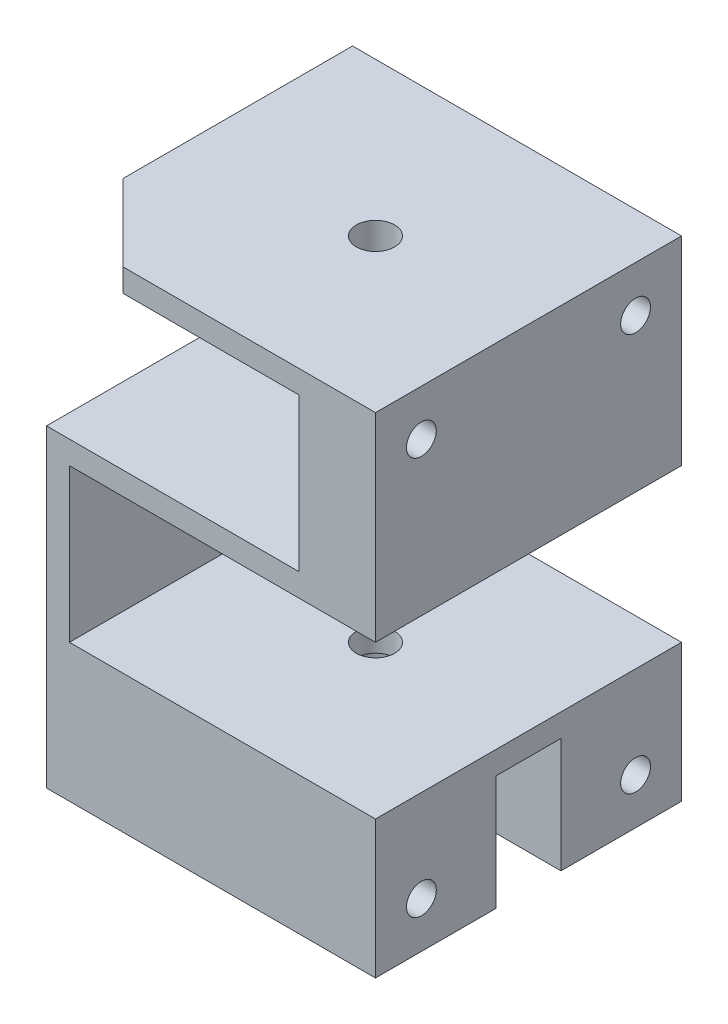
ISO-10303-21;
HEADER;
FILE_DESCRIPTION(('STEP AP214'),'2;1');
FILE_NAME('part.step','',(''),(''),'','','');
FILE_SCHEMA(('AUTOMOTIVE_DESIGN { 1 0 10303 214 1 1 1 1 }'));
ENDSEC;
DATA;
#1=APPLICATION_CONTEXT('core data for automotive mechanical design processes');
#2=APPLICATION_PROTOCOL_DEFINITION('international standard','automotive_design',2000,#1);
#3=PRODUCT_CONTEXT('',#1,'mechanical');
#4=PRODUCT('Part','Part','',(#3));
#5=PRODUCT_RELATED_PRODUCT_CATEGORY('part','',(#4));
#6=PRODUCT_DEFINITION_FORMATION('','',#4);
#7=PRODUCT_DEFINITION_CONTEXT('part definition',#1,'design');
#8=PRODUCT_DEFINITION('design','',#6,#7);
#9=PRODUCT_DEFINITION_SHAPE('','',#8);
#10=(LENGTH_UNIT() NAMED_UNIT(*) SI_UNIT(.MILLI.,.METRE.));
#11=(NAMED_UNIT(*) PLANE_ANGLE_UNIT() SI_UNIT($,.RADIAN.));
#12=(NAMED_UNIT(*) SI_UNIT($,.STERADIAN.) SOLID_ANGLE_UNIT());
#13=UNCERTAINTY_MEASURE_WITH_UNIT(LENGTH_MEASURE(1.E-05),#10,'distance_accuracy_value','');
#14=(GEOMETRIC_REPRESENTATION_CONTEXT(3) GLOBAL_UNCERTAINTY_ASSIGNED_CONTEXT((#13)) GLOBAL_UNIT_ASSIGNED_CONTEXT((#10,
#11,#12)) REPRESENTATION_CONTEXT('',''));
#15=CARTESIAN_POINT('',(0.,0.,0.));
#16=DIRECTION('',(0.,0.,1.));
#17=DIRECTION('',(1.,0.,0.));
#18=AXIS2_PLACEMENT_3D('',#15,#16,#17);
#19=CARTESIAN_POINT('',(-10.,43.,40.));
#20=DIRECTION('',(0.,1.,0.));
#21=DIRECTION('',(0.,0.,1.));
#22=AXIS2_PLACEMENT_3D('',#19,#20,#21);
#23=PLANE('',#22);
#24=CARTESIAN_POINT('',(-20.,43.,20.));
#25=DIRECTION('',(0.,1.,0.));
#26=DIRECTION('',(0.,0.,1.));
#27=AXIS2_PLACEMENT_3D('',#24,#25,#26);
#28=CIRCLE('',#27,3.99999999999999);
#29=CARTESIAN_POINT('',(-20.,43.,24.));
#30=VERTEX_POINT('',#29);
#31=EDGE_CURVE('E348',#30,#30,#28,.T.);
#32=ORIENTED_EDGE('',*,*,#31,.T.);
#33=EDGE_LOOP('',(#32));
#34=FACE_BOUND('',#33,.T.);
#35=DIRECTION('',(1.,0.,0.));
#36=VECTOR('',#35,1.);
#37=CARTESIAN_POINT('',(-10.,43.,40.));
#38=LINE('',#37,#36);
#39=CARTESIAN_POINT('',(-33.,43.,40.));
#40=VERTEX_POINT('',#39);
#41=CARTESIAN_POINT('',(-10.,43.,40.));
#42=VERTEX_POINT('',#41);
#43=EDGE_CURVE('E281',#40,#42,#38,.T.);
#44=ORIENTED_EDGE('',*,*,#43,.F.);
#45=DIRECTION('',(0.707106781186546,0.,0.707106781186549));
#46=VECTOR('',#45,1.);
#47=CARTESIAN_POINT('',(-33.,43.,40.));
#48=LINE('',#47,#46);
#49=CARTESIAN_POINT('',(-43.,43.,30.));
#50=VERTEX_POINT('',#49);
#51=EDGE_CURVE('E55',#40,#50,#48,.F.);
#52=ORIENTED_EDGE('',*,*,#51,.T.);
#53=DIRECTION('',(0.,0.,-1.));
#54=VECTOR('',#53,1.);
#55=CARTESIAN_POINT('',(-43.,43.,40.));
#56=LINE('',#55,#54);
#57=CARTESIAN_POINT('',(-43.,43.,9.));
#58=VERTEX_POINT('',#57);
#59=EDGE_CURVE('E325',#50,#58,#56,.T.);
#60=ORIENTED_EDGE('',*,*,#59,.T.);
#61=DIRECTION('',(-1.,0.,0.));
#62=VECTOR('',#61,1.);
#63=CARTESIAN_POINT('',(-10.,43.,9.));
#64=LINE('',#63,#62);
#65=CARTESIAN_POINT('',(-13.,43.,9.));
#66=VERTEX_POINT('',#65);
#67=EDGE_CURVE('E493',#66,#58,#64,.T.);
#68=ORIENTED_EDGE('',*,*,#67,.F.);
#69=DIRECTION('',(-0.707106781186551,0.,-0.707106781186544));
#70=VECTOR('',#69,1.);
#71=CARTESIAN_POINT('',(-13.,43.,9.));
#72=LINE('',#71,#70);
#73=CARTESIAN_POINT('',(-10.,43.,12.));
#74=VERTEX_POINT('',#73);
#75=EDGE_CURVE('E363',#66,#74,#72,.F.);
#76=ORIENTED_EDGE('',*,*,#75,.T.);
#77=DIRECTION('',(0.,0.,-1.));
#78=VECTOR('',#77,1.);
#79=CARTESIAN_POINT('',(-10.,43.,40.));
#80=LINE('',#79,#78);
#81=EDGE_CURVE('E322',#42,#74,#80,.T.);
#82=ORIENTED_EDGE('',*,*,#81,.F.);
#83=EDGE_LOOP('',(#44,#52,#60,#68,#76,#82));
#84=FACE_BOUND('',#83,.T.);
#85=ADVANCED_FACE('F33',(#34,#84),#23,.F.);
#86=CARTESIAN_POINT('',(-43.,23.,40.));
#87=DIRECTION('',(0.,-1.,0.));
#88=DIRECTION('',(0.,0.,-1.));
#89=AXIS2_PLACEMENT_3D('',#86,#87,#88);
#90=PLANE('',#89);
#91=CARTESIAN_POINT('',(-20.,23.,20.));
#92=DIRECTION('',(0.,-1.,0.));
#93=DIRECTION('',(0.,0.,-1.));
#94=AXIS2_PLACEMENT_3D('',#91,#92,#93);
#95=CIRCLE('',#94,3.99999999999998);
#96=CARTESIAN_POINT('',(-20.,23.,16.));
#97=VERTEX_POINT('',#96);
#98=EDGE_CURVE('E343',#97,#97,#95,.T.);
#99=ORIENTED_EDGE('',*,*,#98,.T.);
#100=EDGE_LOOP('',(#99));
#101=FACE_BOUND('',#100,.T.);
#102=DIRECTION('',(0.,0.,-1.));
#103=VECTOR('',#102,1.);
#104=CARTESIAN_POINT('',(-10.,23.,40.));
#105=LINE('',#104,#103);
#106=CARTESIAN_POINT('',(-10.,23.,40.));
#107=VERTEX_POINT('',#106);
#108=CARTESIAN_POINT('',(-10.,23.,12.));
#109=VERTEX_POINT('',#108);
#110=EDGE_CURVE('E319',#107,#109,#105,.T.);
#111=ORIENTED_EDGE('',*,*,#110,.T.);
#112=DIRECTION('',(0.707106781186551,0.,0.707106781186544));
#113=VECTOR('',#112,1.);
#114=CARTESIAN_POINT('',(-13.,23.,9.));
#115=LINE('',#114,#113);
#116=CARTESIAN_POINT('',(-13.,23.,9.));
#117=VERTEX_POINT('',#116);
#118=EDGE_CURVE('E367',#109,#117,#115,.F.);
#119=ORIENTED_EDGE('',*,*,#118,.T.);
#120=DIRECTION('',(-1.,0.,0.));
#121=VECTOR('',#120,1.);
#122=CARTESIAN_POINT('',(0.,23.,9.));
#123=LINE('',#122,#121);
#124=CARTESIAN_POINT('',(-43.,23.,9.));
#125=VERTEX_POINT('',#124);
#126=EDGE_CURVE('E392',#117,#125,#123,.T.);
#127=ORIENTED_EDGE('',*,*,#126,.T.);
#128=DIRECTION('',(0.,0.,-1.));
#129=VECTOR('',#128,1.);
#130=CARTESIAN_POINT('',(-43.,23.,40.));
#131=LINE('',#130,#129);
#132=CARTESIAN_POINT('',(-43.,23.,40.));
#133=VERTEX_POINT('',#132);
#134=EDGE_CURVE('E316',#133,#125,#131,.T.);
#135=ORIENTED_EDGE('',*,*,#134,.F.);
#136=DIRECTION('',(-1.,0.,0.));
#137=VECTOR('',#136,1.);
#138=CARTESIAN_POINT('',(-43.,23.,40.));
#139=LINE('',#138,#137);
#140=EDGE_CURVE('E285',#107,#133,#139,.T.);
#141=ORIENTED_EDGE('',*,*,#140,.F.);
#142=EDGE_LOOP('',(#111,#119,#127,#135,#141));
#143=FACE_BOUND('',#142,.T.);
#144=ADVANCED_FACE('F390',(#101,#143),#90,.F.);
#145=CARTESIAN_POINT('',(-10.,23.,40.));
#146=DIRECTION('',(1.,0.,0.));
#147=DIRECTION('',(0.,0.,-1.));
#148=AXIS2_PLACEMENT_3D('',#145,#146,#147);
#149=PLANE('',#148);
#150=ORIENTED_EDGE('',*,*,#81,.T.);
#151=DIRECTION('',(0.,-1.,0.));
#152=VECTOR('',#151,1.);
#153=CARTESIAN_POINT('',(-10.,23.,12.));
#154=LINE('',#153,#152);
#155=EDGE_CURVE('E365',#74,#109,#154,.T.);
#156=ORIENTED_EDGE('',*,*,#155,.T.);
#157=ORIENTED_EDGE('',*,*,#110,.F.);
#158=DIRECTION('',(0.,-1.,0.));
#159=VECTOR('',#158,1.);
#160=CARTESIAN_POINT('',(-10.,23.,40.));
#161=LINE('',#160,#159);
#162=EDGE_CURVE('E283',#42,#107,#161,.T.);
#163=ORIENTED_EDGE('',*,*,#162,.F.);
#164=EDGE_LOOP('',(#150,#156,#157,#163));
#165=FACE_BOUND('',#164,.T.);
#166=ADVANCED_FACE('F384',(#165),#149,.F.);
#167=CARTESIAN_POINT('',(-20.,46.,20.));
#168=DIRECTION('',(0.,-1.,0.));
#169=DIRECTION('',(1.,0.,0.));
#170=AXIS2_PLACEMENT_3D('',#167,#168,#169);
#171=CYLINDRICAL_SURFACE('',#170,2.5);
#172=CARTESIAN_POINT('',(-20.,0.,20.));
#173=DIRECTION('',(0.,-1.,0.));
#174=DIRECTION('',(1.,0.,0.));
#175=AXIS2_PLACEMENT_3D('',#172,#173,#174);
#176=CIRCLE('',#175,2.5);
#177=CARTESIAN_POINT('',(-17.5,0.,20.));
#178=VERTEX_POINT('',#177);
#179=EDGE_CURVE('E262',#178,#178,#176,.T.);
#180=ORIENTED_EDGE('',*,*,#179,.F.);
#181=EDGE_LOOP('',(#180));
#182=FACE_BOUND('',#181,.T.);
#183=CARTESIAN_POINT('',(-20.,-3.,20.));
#184=DIRECTION('',(0.,-1.,0.));
#185=DIRECTION('',(1.,0.,0.));
#186=AXIS2_PLACEMENT_3D('',#183,#184,#185);
#187=CIRCLE('',#186,2.5);
#188=CARTESIAN_POINT('',(-17.5,-3.,20.));
#189=VERTEX_POINT('',#188);
#190=EDGE_CURVE('E248',#189,#189,#187,.F.);
#191=ORIENTED_EDGE('',*,*,#190,.F.);
#192=EDGE_LOOP('',(#191));
#193=FACE_BOUND('',#192,.T.);
#194=ADVANCED_FACE('F462',(#182,#193),#171,.F.);
#195=CARTESIAN_POINT('',(0.,0.,40.));
#196=DIRECTION('',(-1.,0.,0.));
#197=DIRECTION('',(0.,-1.,0.));
#198=AXIS2_PLACEMENT_3D('',#195,#196,#197);
#199=PLANE('',#198);
#200=CARTESIAN_POINT('',(0.,-12.,34.));
#201=DIRECTION('',(1.,0.,0.));
#202=DIRECTION('',(0.,1.,0.));
#203=AXIS2_PLACEMENT_3D('',#200,#201,#202);
#204=CIRCLE('',#203,1.95);
#205=CARTESIAN_POINT('',(0.,-10.05,34.));
#206=VERTEX_POINT('',#205);
#207=EDGE_CURVE('E589',#206,#206,#204,.T.);
#208=ORIENTED_EDGE('',*,*,#207,.F.);
#209=EDGE_LOOP('',(#208));
#210=FACE_BOUND('',#209,.T.);
#211=CARTESIAN_POINT('',(0.,-12.,6.));
#212=DIRECTION('',(1.,0.,0.));
#213=DIRECTION('',(0.,1.,0.));
#214=AXIS2_PLACEMENT_3D('',#211,#212,#213);
#215=CIRCLE('',#214,1.95);
#216=CARTESIAN_POINT('',(0.,-10.05,6.));
#217=VERTEX_POINT('',#216);
#218=EDGE_CURVE('E595',#217,#217,#215,.T.);
#219=ORIENTED_EDGE('',*,*,#218,.F.);
#220=EDGE_LOOP('',(#219));
#221=FACE_BOUND('',#220,.T.);
#222=DIRECTION('',(0.,0.,-1.));
#223=VECTOR('',#222,1.);
#224=CARTESIAN_POINT('',(0.,-18.,40.));
#225=LINE('',#224,#223);
#226=CARTESIAN_POINT('',(0.,-18.,40.));
#227=VERTEX_POINT('',#226);
#228=CARTESIAN_POINT('',(0.,-18.,24.25));
#229=VERTEX_POINT('',#228);
#230=EDGE_CURVE('E310',#227,#229,#225,.T.);
#231=ORIENTED_EDGE('',*,*,#230,.T.);
#232=DIRECTION('',(0.,-1.,0.));
#233=VECTOR('',#232,1.);
#234=CARTESIAN_POINT('',(0.,-3.,24.25));
#235=LINE('',#234,#233);
#236=CARTESIAN_POINT('',(0.,-3.,24.25));
#237=VERTEX_POINT('',#236);
#238=EDGE_CURVE('E249',#237,#229,#235,.T.);
#239=ORIENTED_EDGE('',*,*,#238,.F.);
#240=DIRECTION('',(0.,0.,1.));
#241=VECTOR('',#240,1.);
#242=CARTESIAN_POINT('',(0.,-3.,24.25));
#243=LINE('',#242,#241);
#244=CARTESIAN_POINT('',(0.,-3.,15.75));
#245=VERTEX_POINT('',#244);
#246=EDGE_CURVE('E235',#245,#237,#243,.T.);
#247=ORIENTED_EDGE('',*,*,#246,.F.);
#248=DIRECTION('',(0.,-1.,0.));
#249=VECTOR('',#248,1.);
#250=CARTESIAN_POINT('',(0.,-3.,15.75));
#251=LINE('',#250,#249);
#252=CARTESIAN_POINT('',(0.,-18.,15.75));
#253=VERTEX_POINT('',#252);
#254=EDGE_CURVE('E251',#245,#253,#251,.T.);
#255=ORIENTED_EDGE('',*,*,#254,.T.);
#256=CARTESIAN_POINT('',(0.,-18.,0.));
#257=VERTEX_POINT('',#256);
#258=EDGE_CURVE('E291',#253,#257,#225,.T.);
#259=ORIENTED_EDGE('',*,*,#258,.T.);
#260=DIRECTION('',(0.,1.,0.));
#261=VECTOR('',#260,1.);
#262=CARTESIAN_POINT('',(0.,0.,0.));
#263=LINE('',#262,#261);
#264=CARTESIAN_POINT('',(0.,0.,0.));
#265=VERTEX_POINT('',#264);
#266=EDGE_CURVE('E265',#257,#265,#263,.T.);
#267=ORIENTED_EDGE('',*,*,#266,.T.);
#268=DIRECTION('',(0.,0.,-1.));
#269=VECTOR('',#268,1.);
#270=CARTESIAN_POINT('',(0.,0.,40.));
#271=LINE('',#270,#269);
#272=CARTESIAN_POINT('',(0.,0.,40.));
#273=VERTEX_POINT('',#272);
#274=EDGE_CURVE('E340',#273,#265,#271,.T.);
#275=ORIENTED_EDGE('',*,*,#274,.F.);
#276=DIRECTION('',(0.,1.,0.));
#277=VECTOR('',#276,1.);
#278=CARTESIAN_POINT('',(0.,0.,40.));
#279=LINE('',#278,#277);
#280=EDGE_CURVE('E266',#227,#273,#279,.T.);
#281=ORIENTED_EDGE('',*,*,#280,.F.);
#282=EDGE_LOOP('',(#231,#239,#247,#255,#259,#267,#275,#281));
#283=FACE_BOUND('',#282,.T.);
#284=ADVANCED_FACE('F408',(#210,#221,#283),#199,.F.);
#285=CARTESIAN_POINT('',(0.,0.,40.));
#286=DIRECTION('',(0.,-1.,0.));
#287=DIRECTION('',(1.,0.,0.));
#288=AXIS2_PLACEMENT_3D('',#285,#286,#287);
#289=PLANE('',#288);
#290=ORIENTED_EDGE('',*,*,#179,.T.);
#291=EDGE_LOOP('',(#290));
#292=FACE_BOUND('',#291,.T.);
#293=DIRECTION('',(-1.,0.,0.));
#294=VECTOR('',#293,1.);
#295=CARTESIAN_POINT('',(0.,0.,0.));
#296=LINE('',#295,#294);
#297=CARTESIAN_POINT('',(-40.,0.,0.));
#298=VERTEX_POINT('',#297);
#299=EDGE_CURVE('E294',#265,#298,#296,.T.);
#300=ORIENTED_EDGE('',*,*,#299,.T.);
#301=DIRECTION('',(0.,0.,-1.));
#302=VECTOR('',#301,1.);
#303=CARTESIAN_POINT('',(-40.,0.,40.));
#304=LINE('',#303,#302);
#305=CARTESIAN_POINT('',(-40.,0.,40.));
#306=VERTEX_POINT('',#305);
#307=EDGE_CURVE('E337',#306,#298,#304,.T.);
#308=ORIENTED_EDGE('',*,*,#307,.F.);
#309=DIRECTION('',(-1.,0.,0.));
#310=VECTOR('',#309,1.);
#311=CARTESIAN_POINT('',(0.,0.,40.));
#312=LINE('',#311,#310);
#313=EDGE_CURVE('E269',#273,#306,#312,.T.);
#314=ORIENTED_EDGE('',*,*,#313,.F.);
#315=ORIENTED_EDGE('',*,*,#274,.T.);
#316=EDGE_LOOP('',(#300,#308,#314,#315));
#317=FACE_BOUND('',#316,.T.);
#318=ADVANCED_FACE('F411',(#292,#317),#289,.F.);
#319=CARTESIAN_POINT('',(-40.,0.,40.));
#320=DIRECTION('',(-1.,0.,0.));
#321=DIRECTION('',(0.,0.,1.));
#322=AXIS2_PLACEMENT_3D('',#319,#320,#321);
#323=PLANE('',#322);
#324=DIRECTION('',(0.,0.,-1.));
#325=VECTOR('',#324,1.);
#326=CARTESIAN_POINT('',(-40.,7.75,22.5));
#327=LINE('',#326,#325);
#328=CARTESIAN_POINT('',(-40.,7.75,22.5));
#329=VERTEX_POINT('',#328);
#330=CARTESIAN_POINT('',(-40.,7.75,17.5));
#331=VERTEX_POINT('',#330);
#332=EDGE_CURVE('E196',#329,#331,#327,.T.);
#333=ORIENTED_EDGE('',*,*,#332,.F.);
#334=CARTESIAN_POINT('',(-40.,10.,22.5));
#335=DIRECTION('',(1.,0.,0.));
#336=DIRECTION('',(0.,0.,-1.));
#337=AXIS2_PLACEMENT_3D('',#334,#335,#336);
#338=CIRCLE('',#337,2.25);
#339=CARTESIAN_POINT('',(-40.,12.25,22.5));
#340=VERTEX_POINT('',#339);
#341=EDGE_CURVE('E201',#340,#329,#338,.T.);
#342=ORIENTED_EDGE('',*,*,#341,.F.);
#343=DIRECTION('',(0.,0.,1.));
#344=VECTOR('',#343,1.);
#345=CARTESIAN_POINT('',(-40.,12.25,22.5));
#346=LINE('',#345,#344);
#347=CARTESIAN_POINT('',(-40.,12.25,17.5));
#348=VERTEX_POINT('',#347);
#349=EDGE_CURVE('E206',#348,#340,#346,.T.);
#350=ORIENTED_EDGE('',*,*,#349,.F.);
#351=CARTESIAN_POINT('',(-40.,10.,17.5));
#352=DIRECTION('',(1.,0.,0.));
#353=DIRECTION('',(0.,0.,-1.));
#354=AXIS2_PLACEMENT_3D('',#351,#352,#353);
#355=CIRCLE('',#354,2.25);
#356=EDGE_CURVE('E185',#331,#348,#355,.T.);
#357=ORIENTED_EDGE('',*,*,#356,.F.);
#358=EDGE_LOOP('',(#333,#342,#350,#357));
#359=FACE_BOUND('',#358,.T.);
#360=DIRECTION('',(0.,1.,0.));
#361=VECTOR('',#360,1.);
#362=CARTESIAN_POINT('',(-40.,0.,0.));
#363=LINE('',#362,#361);
#364=CARTESIAN_POINT('',(-40.,20.,0.));
#365=VERTEX_POINT('',#364);
#366=EDGE_CURVE('E296',#298,#365,#363,.T.);
#367=ORIENTED_EDGE('',*,*,#366,.T.);
#368=DIRECTION('',(0.,0.,-1.));
#369=VECTOR('',#368,1.);
#370=CARTESIAN_POINT('',(-40.,20.,40.));
#371=LINE('',#370,#369);
#372=CARTESIAN_POINT('',(-40.,20.,40.));
#373=VERTEX_POINT('',#372);
#374=EDGE_CURVE('E334',#373,#365,#371,.T.);
#375=ORIENTED_EDGE('',*,*,#374,.F.);
#376=DIRECTION('',(0.,1.,0.));
#377=VECTOR('',#376,1.);
#378=CARTESIAN_POINT('',(-40.,0.,40.));
#379=LINE('',#378,#377);
#380=EDGE_CURVE('E272',#306,#373,#379,.T.);
#381=ORIENTED_EDGE('',*,*,#380,.F.);
#382=ORIENTED_EDGE('',*,*,#307,.T.);
#383=EDGE_LOOP('',(#367,#375,#381,#382));
#384=FACE_BOUND('',#383,.T.);
#385=ADVANCED_FACE('F203',(#359,#384),#323,.F.);
#386=CARTESIAN_POINT('',(-40.,20.,40.));
#387=DIRECTION('',(0.,1.,0.));
#388=DIRECTION('',(-1.,0.,0.));
#389=AXIS2_PLACEMENT_3D('',#386,#387,#388);
#390=PLANE('',#389);
#391=CARTESIAN_POINT('',(-20.,20.,20.));
#392=DIRECTION('',(0.,1.,0.));
#393=DIRECTION('',(-1.,0.,0.));
#394=AXIS2_PLACEMENT_3D('',#391,#392,#393);
#395=CIRCLE('',#394,2.5);
#396=CARTESIAN_POINT('',(-22.5,20.,20.));
#397=VERTEX_POINT('',#396);
#398=EDGE_CURVE('E259',#397,#397,#395,.T.);
#399=ORIENTED_EDGE('',*,*,#398,.T.);
#400=EDGE_LOOP('',(#399));
#401=FACE_BOUND('',#400,.T.);
#402=DIRECTION('',(1.,0.,0.));
#403=VECTOR('',#402,1.);
#404=CARTESIAN_POINT('',(-40.,20.,0.));
#405=LINE('',#404,#403);
#406=CARTESIAN_POINT('',(0.,20.,0.));
#407=VERTEX_POINT('',#406);
#408=EDGE_CURVE('E298',#365,#407,#405,.T.);
#409=ORIENTED_EDGE('',*,*,#408,.T.);
#410=DIRECTION('',(0.,0.,-1.));
#411=VECTOR('',#410,1.);
#412=CARTESIAN_POINT('',(0.,20.,40.));
#413=LINE('',#412,#411);
#414=CARTESIAN_POINT('',(0.,20.,40.));
#415=VERTEX_POINT('',#414);
#416=EDGE_CURVE('E331',#415,#407,#413,.T.);
#417=ORIENTED_EDGE('',*,*,#416,.F.);
#418=DIRECTION('',(1.,0.,0.));
#419=VECTOR('',#418,1.);
#420=CARTESIAN_POINT('',(-40.,20.,40.));
#421=LINE('',#420,#419);
#422=EDGE_CURVE('E274',#373,#415,#421,.T.);
#423=ORIENTED_EDGE('',*,*,#422,.F.);
#424=ORIENTED_EDGE('',*,*,#374,.T.);
#425=EDGE_LOOP('',(#409,#417,#423,#424));
#426=FACE_BOUND('',#425,.T.);
#427=ADVANCED_FACE('F420',(#401,#426),#390,.F.);
#428=CARTESIAN_POINT('',(0.,20.,40.));
#429=DIRECTION('',(-1.,0.,0.));
#430=DIRECTION('',(0.,-1.,0.));
#431=AXIS2_PLACEMENT_3D('',#428,#429,#430);
#432=PLANE('',#431);
#433=CARTESIAN_POINT('',(0.,40.,6.));
#434=DIRECTION('',(1.,0.,0.));
#435=DIRECTION('',(0.,1.,0.));
#436=AXIS2_PLACEMENT_3D('',#433,#434,#435);
#437=CIRCLE('',#436,1.95);
#438=CARTESIAN_POINT('',(0.,41.95,6.));
#439=VERTEX_POINT('',#438);
#440=EDGE_CURVE('E580',#439,#439,#437,.T.);
#441=ORIENTED_EDGE('',*,*,#440,.F.);
#442=EDGE_LOOP('',(#441));
#443=FACE_BOUND('',#442,.T.);
#444=CARTESIAN_POINT('',(0.,40.,34.));
#445=DIRECTION('',(1.,0.,0.));
#446=DIRECTION('',(0.,1.,0.));
#447=AXIS2_PLACEMENT_3D('',#444,#445,#446);
#448=CIRCLE('',#447,1.95);
#449=CARTESIAN_POINT('',(0.,41.95,34.));
#450=VERTEX_POINT('',#449);
#451=EDGE_CURVE('E496',#450,#450,#448,.T.);
#452=ORIENTED_EDGE('',*,*,#451,.F.);
#453=EDGE_LOOP('',(#452));
#454=FACE_BOUND('',#453,.T.);
#455=DIRECTION('',(0.,1.,0.));
#456=VECTOR('',#455,1.);
#457=CARTESIAN_POINT('',(0.,20.,0.));
#458=LINE('',#457,#456);
#459=CARTESIAN_POINT('',(0.,46.,0.));
#460=VERTEX_POINT('',#459);
#461=EDGE_CURVE('E300',#407,#460,#458,.T.);
#462=ORIENTED_EDGE('',*,*,#461,.T.);
#463=DIRECTION('',(0.,0.,-1.));
#464=VECTOR('',#463,1.);
#465=CARTESIAN_POINT('',(0.,46.,40.));
#466=LINE('',#465,#464);
#467=CARTESIAN_POINT('',(0.,46.,40.));
#468=VERTEX_POINT('',#467);
#469=EDGE_CURVE('E329',#468,#460,#466,.T.);
#470=ORIENTED_EDGE('',*,*,#469,.F.);
#471=DIRECTION('',(0.,1.,0.));
#472=VECTOR('',#471,1.);
#473=CARTESIAN_POINT('',(0.,20.,40.));
#474=LINE('',#473,#472);
#475=EDGE_CURVE('E276',#415,#468,#474,.T.);
#476=ORIENTED_EDGE('',*,*,#475,.F.);
#477=ORIENTED_EDGE('',*,*,#416,.T.);
#478=EDGE_LOOP('',(#462,#470,#476,#477));
#479=FACE_BOUND('',#478,.T.);
#480=ADVANCED_FACE('F424',(#443,#454,#479),#432,.F.);
#481=CARTESIAN_POINT('',(0.,46.,40.));
#482=DIRECTION('',(0.,-1.,0.));
#483=DIRECTION('',(1.,0.,0.));
#484=AXIS2_PLACEMENT_3D('',#481,#482,#483);
#485=PLANE('',#484);
#486=DIRECTION('',(0.,0.,-1.));
#487=VECTOR('',#486,1.);
#488=CARTESIAN_POINT('',(-43.,46.,40.));
#489=LINE('',#488,#487);
#490=CARTESIAN_POINT('',(-43.,46.,30.));
#491=VERTEX_POINT('',#490);
#492=CARTESIAN_POINT('',(-43.,46.,0.));
#493=VERTEX_POINT('',#492);
#494=EDGE_CURVE('E327',#491,#493,#489,.T.);
#495=ORIENTED_EDGE('',*,*,#494,.F.);
#496=DIRECTION('',(-0.707106781186546,0.,-0.707106781186549));
#497=VECTOR('',#496,1.);
#498=CARTESIAN_POINT('',(-33.,46.,40.));
#499=LINE('',#498,#497);
#500=CARTESIAN_POINT('',(-33.,46.,40.));
#501=VERTEX_POINT('',#500);
#502=EDGE_CURVE('E11',#491,#501,#499,.F.);
#503=ORIENTED_EDGE('',*,*,#502,.T.);
#504=DIRECTION('',(-1.,0.,0.));
#505=VECTOR('',#504,1.);
#506=CARTESIAN_POINT('',(0.,46.,40.));
#507=LINE('',#506,#505);
#508=EDGE_CURVE('E278',#468,#501,#507,.T.);
#509=ORIENTED_EDGE('',*,*,#508,.F.);
#510=ORIENTED_EDGE('',*,*,#469,.T.);
#511=DIRECTION('',(-1.,0.,0.));
#512=VECTOR('',#511,1.);
#513=CARTESIAN_POINT('',(0.,46.,0.));
#514=LINE('',#513,#512);
#515=EDGE_CURVE('E303',#460,#493,#514,.T.);
#516=ORIENTED_EDGE('',*,*,#515,.T.);
#517=EDGE_LOOP('',(#495,#503,#509,#510,#516));
#518=FACE_BOUND('',#517,.T.);
#519=CARTESIAN_POINT('',(-20.,46.,20.));
#520=DIRECTION('',(0.,-1.,0.));
#521=DIRECTION('',(1.,0.,0.));
#522=AXIS2_PLACEMENT_3D('',#519,#520,#521);
#523=CIRCLE('',#522,2.5);
#524=CARTESIAN_POINT('',(-17.5,46.,20.));
#525=VERTEX_POINT('',#524);
#526=EDGE_CURVE('E256',#525,#525,#523,.T.);
#527=ORIENTED_EDGE('',*,*,#526,.T.);
#528=EDGE_LOOP('',(#527));
#529=FACE_BOUND('',#528,.T.);
#530=ADVANCED_FACE('F427',(#518,#529),#485,.F.);
#531=CARTESIAN_POINT('',(-43.,23.,40.));
#532=DIRECTION('',(1.,0.,0.));
#533=DIRECTION('',(0.,1.,0.));
#534=AXIS2_PLACEMENT_3D('',#531,#532,#533);
#535=PLANE('',#534);
#536=DIRECTION('',(0.,0.,1.));
#537=VECTOR('',#536,1.);
#538=CARTESIAN_POINT('',(-43.,12.25,40.));
#539=LINE('',#538,#537);
#540=CARTESIAN_POINT('',(-43.,12.25,17.5));
#541=VERTEX_POINT('',#540);
#542=CARTESIAN_POINT('',(-43.,12.25,22.5));
#543=VERTEX_POINT('',#542);
#544=EDGE_CURVE('E354',#541,#543,#539,.T.);
#545=ORIENTED_EDGE('',*,*,#544,.T.);
#546=CARTESIAN_POINT('',(-43.,10.,22.5));
#547=DIRECTION('',(1.,0.,0.));
#548=DIRECTION('',(0.,1.,0.));
#549=AXIS2_PLACEMENT_3D('',#546,#547,#548);
#550=CIRCLE('',#549,2.25);
#551=CARTESIAN_POINT('',(-43.,7.75,22.5));
#552=VERTEX_POINT('',#551);
#553=EDGE_CURVE('E357',#543,#552,#550,.T.);
#554=ORIENTED_EDGE('',*,*,#553,.T.);
#555=DIRECTION('',(0.,0.,-1.));
#556=VECTOR('',#555,1.);
#557=CARTESIAN_POINT('',(-43.,7.75,40.));
#558=LINE('',#557,#556);
#559=CARTESIAN_POINT('',(-43.,7.75,17.5));
#560=VERTEX_POINT('',#559);
#561=EDGE_CURVE('E351',#552,#560,#558,.T.);
#562=ORIENTED_EDGE('',*,*,#561,.T.);
#563=CARTESIAN_POINT('',(-43.,10.,17.5));
#564=DIRECTION('',(1.,0.,0.));
#565=DIRECTION('',(0.,1.,0.));
#566=AXIS2_PLACEMENT_3D('',#563,#564,#565);
#567=CIRCLE('',#566,2.25);
#568=EDGE_CURVE('E188',#560,#541,#567,.T.);
#569=ORIENTED_EDGE('',*,*,#568,.T.);
#570=EDGE_LOOP('',(#545,#554,#562,#569));
#571=FACE_BOUND('',#570,.T.);
#572=ORIENTED_EDGE('',*,*,#59,.F.);
#573=DIRECTION('',(0.,1.,0.));
#574=VECTOR('',#573,1.);
#575=CARTESIAN_POINT('',(-43.,23.,30.));
#576=LINE('',#575,#574);
#577=EDGE_CURVE('E41',#50,#491,#576,.T.);
#578=ORIENTED_EDGE('',*,*,#577,.T.);
#579=ORIENTED_EDGE('',*,*,#494,.T.);
#580=DIRECTION('',(0.,-1.,0.));
#581=VECTOR('',#580,1.);
#582=CARTESIAN_POINT('',(-43.,23.,0.));
#583=LINE('',#582,#581);
#584=CARTESIAN_POINT('',(-43.,-18.,0.));
#585=VERTEX_POINT('',#584);
#586=EDGE_CURVE('E306',#493,#585,#583,.T.);
#587=ORIENTED_EDGE('',*,*,#586,.T.);
#588=DIRECTION('',(0.,0.,-1.));
#589=VECTOR('',#588,1.);
#590=CARTESIAN_POINT('',(-43.,-18.,40.));
#591=LINE('',#590,#589);
#592=CARTESIAN_POINT('',(-43.,-18.,40.));
#593=VERTEX_POINT('',#592);
#594=EDGE_CURVE('E313',#593,#585,#591,.T.);
#595=ORIENTED_EDGE('',*,*,#594,.F.);
#596=DIRECTION('',(0.,-1.,0.));
#597=VECTOR('',#596,1.);
#598=CARTESIAN_POINT('',(-43.,23.,40.));
#599=LINE('',#598,#597);
#600=EDGE_CURVE('E287',#133,#593,#599,.T.);
#601=ORIENTED_EDGE('',*,*,#600,.F.);
#602=ORIENTED_EDGE('',*,*,#134,.T.);
#603=DIRECTION('',(0.,1.,0.));
#604=VECTOR('',#603,1.);
#605=CARTESIAN_POINT('',(-43.,46.,9.));
#606=LINE('',#605,#604);
#607=EDGE_CURVE('E490',#125,#58,#606,.T.);
#608=ORIENTED_EDGE('',*,*,#607,.T.);
#609=EDGE_LOOP('',(#572,#578,#579,#587,#595,#601,#602,#608));
#610=FACE_BOUND('',#609,.T.);
#611=ADVANCED_FACE('F395',(#571,#610),#535,.F.);
#612=CARTESIAN_POINT('',(0.,-18.,40.));
#613=DIRECTION('',(0.,1.,0.));
#614=DIRECTION('',(-1.,0.,0.));
#615=AXIS2_PLACEMENT_3D('',#612,#613,#614);
#616=PLANE('',#615);
#617=CARTESIAN_POINT('',(-20.,-18.,20.));
#618=DIRECTION('',(0.,-1.,0.));
#619=DIRECTION('',(1.,0.,0.));
#620=AXIS2_PLACEMENT_3D('',#617,#618,#619);
#621=CIRCLE('',#620,4.25);
#622=CARTESIAN_POINT('',(-20.,-18.,24.25));
#623=VERTEX_POINT('',#622);
#624=CARTESIAN_POINT('',(-20.,-18.,15.75));
#625=VERTEX_POINT('',#624);
#626=EDGE_CURVE('E227',#623,#625,#621,.T.);
#627=ORIENTED_EDGE('',*,*,#626,.F.);
#628=DIRECTION('',(-1.,0.,0.));
#629=VECTOR('',#628,1.);
#630=CARTESIAN_POINT('',(-20.,-18.,24.25));
#631=LINE('',#630,#629);
#632=EDGE_CURVE('E232',#229,#623,#631,.T.);
#633=ORIENTED_EDGE('',*,*,#632,.F.);
#634=ORIENTED_EDGE('',*,*,#230,.F.);
#635=DIRECTION('',(1.,0.,0.));
#636=VECTOR('',#635,1.);
#637=CARTESIAN_POINT('',(0.,-18.,40.));
#638=LINE('',#637,#636);
#639=EDGE_CURVE('E289',#593,#227,#638,.T.);
#640=ORIENTED_EDGE('',*,*,#639,.F.);
#641=ORIENTED_EDGE('',*,*,#594,.T.);
#642=DIRECTION('',(1.,0.,0.));
#643=VECTOR('',#642,1.);
#644=CARTESIAN_POINT('',(0.,-18.,0.));
#645=LINE('',#644,#643);
#646=EDGE_CURVE('E270',#585,#257,#645,.T.);
#647=ORIENTED_EDGE('',*,*,#646,.T.);
#648=ORIENTED_EDGE('',*,*,#258,.F.);
#649=DIRECTION('',(1.,0.,0.));
#650=VECTOR('',#649,1.);
#651=CARTESIAN_POINT('',(0.,-18.,15.75));
#652=LINE('',#651,#650);
#653=EDGE_CURVE('E242',#625,#253,#652,.T.);
#654=ORIENTED_EDGE('',*,*,#653,.F.);
#655=EDGE_LOOP('',(#627,#633,#634,#640,#641,#647,#648,#654));
#656=FACE_BOUND('',#655,.T.);
#657=ADVANCED_FACE('F402',(#656),#616,.F.);
#658=CARTESIAN_POINT('',(0.,0.,40.));
#659=DIRECTION('',(0.,0.,-1.));
#660=DIRECTION('',(-1.,0.,0.));
#661=AXIS2_PLACEMENT_3D('',#658,#659,#660);
#662=PLANE('',#661);
#663=ORIENTED_EDGE('',*,*,#508,.T.);
#664=DIRECTION('',(0.,-1.,0.));
#665=VECTOR('',#664,1.);
#666=CARTESIAN_POINT('',(-33.,0.,40.));
#667=LINE('',#666,#665);
#668=EDGE_CURVE('E369',#501,#40,#667,.T.);
#669=ORIENTED_EDGE('',*,*,#668,.T.);
#670=ORIENTED_EDGE('',*,*,#43,.T.);
#671=ORIENTED_EDGE('',*,*,#162,.T.);
#672=ORIENTED_EDGE('',*,*,#140,.T.);
#673=ORIENTED_EDGE('',*,*,#600,.T.);
#674=ORIENTED_EDGE('',*,*,#639,.T.);
#675=ORIENTED_EDGE('',*,*,#280,.T.);
#676=ORIENTED_EDGE('',*,*,#313,.T.);
#677=ORIENTED_EDGE('',*,*,#380,.T.);
#678=ORIENTED_EDGE('',*,*,#422,.T.);
#679=ORIENTED_EDGE('',*,*,#475,.T.);
#680=EDGE_LOOP('',(#663,#669,#670,#671,#672,#673,#674,#675,#676,#677,#678,#679));
#681=FACE_BOUND('',#680,.T.);
#682=ADVANCED_FACE('F374',(#681),#662,.F.);
#683=CARTESIAN_POINT('',(0.,0.,0.));
#684=DIRECTION('',(0.,0.,-1.));
#685=DIRECTION('',(-1.,0.,0.));
#686=AXIS2_PLACEMENT_3D('',#683,#684,#685);
#687=PLANE('',#686);
#688=ORIENTED_EDGE('',*,*,#586,.F.);
#689=ORIENTED_EDGE('',*,*,#515,.F.);
#690=ORIENTED_EDGE('',*,*,#461,.F.);
#691=ORIENTED_EDGE('',*,*,#408,.F.);
#692=ORIENTED_EDGE('',*,*,#366,.F.);
#693=ORIENTED_EDGE('',*,*,#299,.F.);
#694=ORIENTED_EDGE('',*,*,#266,.F.);
#695=ORIENTED_EDGE('',*,*,#646,.F.);
#696=EDGE_LOOP('',(#688,#689,#690,#691,#692,#693,#694,#695));
#697=FACE_BOUND('',#696,.T.);
#698=ADVANCED_FACE('F512',(#697),#687,.T.);
#699=ORIENTED_EDGE('',*,*,#398,.F.);
#700=EDGE_LOOP('',(#699));
#701=FACE_BOUND('',#700,.T.);
#702=CARTESIAN_POINT('',(-20.,23.5,20.));
#703=DIRECTION('',(0.,1.,0.));
#704=DIRECTION('',(0.,0.,1.));
#705=AXIS2_PLACEMENT_3D('',#702,#703,#704);
#706=CIRCLE('',#705,2.5);
#707=CARTESIAN_POINT('',(-20.,23.5,22.5));
#708=VERTEX_POINT('',#707);
#709=EDGE_CURVE('E221',#708,#708,#706,.T.);
#710=ORIENTED_EDGE('',*,*,#709,.T.);
#711=EDGE_LOOP('',(#710));
#712=FACE_BOUND('',#711,.T.);
#713=ADVANCED_FACE('F515',(#701,#712),#171,.F.);
#714=ORIENTED_EDGE('',*,*,#526,.F.);
#715=EDGE_LOOP('',(#714));
#716=FACE_BOUND('',#715,.T.);
#717=CARTESIAN_POINT('',(-20.,42.5,20.));
#718=DIRECTION('',(0.,-1.,0.));
#719=DIRECTION('',(0.,0.,-1.));
#720=AXIS2_PLACEMENT_3D('',#717,#718,#719);
#721=CIRCLE('',#720,2.5);
#722=CARTESIAN_POINT('',(-20.,42.5,17.5));
#723=VERTEX_POINT('',#722);
#724=EDGE_CURVE('E213',#723,#723,#721,.T.);
#725=ORIENTED_EDGE('',*,*,#724,.T.);
#726=EDGE_LOOP('',(#725));
#727=FACE_BOUND('',#726,.T.);
#728=ADVANCED_FACE('F522',(#716,#727),#171,.F.);
#729=CARTESIAN_POINT('',(-20.,-3.,20.));
#730=DIRECTION('',(0.,-1.,0.));
#731=DIRECTION('',(1.,0.,0.));
#732=AXIS2_PLACEMENT_3D('',#729,#730,#731);
#733=PLANE('',#732);
#734=CARTESIAN_POINT('',(-20.,-3.,20.));
#735=DIRECTION('',(0.,-1.,0.));
#736=DIRECTION('',(1.,0.,0.));
#737=AXIS2_PLACEMENT_3D('',#734,#735,#736);
#738=CIRCLE('',#737,4.25);
#739=CARTESIAN_POINT('',(-20.,-3.,24.25));
#740=VERTEX_POINT('',#739);
#741=CARTESIAN_POINT('',(-20.,-3.,15.75));
#742=VERTEX_POINT('',#741);
#743=EDGE_CURVE('E228',#740,#742,#738,.T.);
#744=ORIENTED_EDGE('',*,*,#743,.T.);
#745=DIRECTION('',(1.,0.,0.));
#746=VECTOR('',#745,1.);
#747=CARTESIAN_POINT('',(0.,-3.,15.75));
#748=LINE('',#747,#746);
#749=EDGE_CURVE('E231',#742,#245,#748,.T.);
#750=ORIENTED_EDGE('',*,*,#749,.T.);
#751=ORIENTED_EDGE('',*,*,#246,.T.);
#752=DIRECTION('',(-1.,0.,0.));
#753=VECTOR('',#752,1.);
#754=CARTESIAN_POINT('',(-20.,-3.,24.25));
#755=LINE('',#754,#753);
#756=EDGE_CURVE('E237',#237,#740,#755,.T.);
#757=ORIENTED_EDGE('',*,*,#756,.T.);
#758=EDGE_LOOP('',(#744,#750,#751,#757));
#759=FACE_BOUND('',#758,.T.);
#760=ORIENTED_EDGE('',*,*,#190,.T.);
#761=EDGE_LOOP('',(#760));
#762=FACE_BOUND('',#761,.T.);
#763=ADVANCED_FACE('F527',(#759,#762),#733,.T.);
#764=CARTESIAN_POINT('',(-20.,-3.,20.));
#765=DIRECTION('',(0.,-1.,0.));
#766=DIRECTION('',(1.,0.,0.));
#767=AXIS2_PLACEMENT_3D('',#764,#765,#766);
#768=CYLINDRICAL_SURFACE('',#767,4.25);
#769=ORIENTED_EDGE('',*,*,#626,.T.);
#770=DIRECTION('',(0.,-1.,0.));
#771=VECTOR('',#770,1.);
#772=CARTESIAN_POINT('',(-20.,-3.,15.75));
#773=LINE('',#772,#771);
#774=EDGE_CURVE('E240',#742,#625,#773,.T.);
#775=ORIENTED_EDGE('',*,*,#774,.F.);
#776=ORIENTED_EDGE('',*,*,#743,.F.);
#777=DIRECTION('',(0.,-1.,0.));
#778=VECTOR('',#777,1.);
#779=CARTESIAN_POINT('',(-20.,-3.,24.25));
#780=LINE('',#779,#778);
#781=EDGE_CURVE('E246',#740,#623,#780,.T.);
#782=ORIENTED_EDGE('',*,*,#781,.T.);
#783=EDGE_LOOP('',(#769,#775,#776,#782));
#784=FACE_BOUND('',#783,.T.);
#785=ADVANCED_FACE('F523',(#784),#768,.F.);
#786=CARTESIAN_POINT('',(-20.,-3.,24.25));
#787=DIRECTION('',(0.,0.,1.));
#788=DIRECTION('',(1.,0.,0.));
#789=AXIS2_PLACEMENT_3D('',#786,#787,#788);
#790=PLANE('',#789);
#791=ORIENTED_EDGE('',*,*,#632,.T.);
#792=ORIENTED_EDGE('',*,*,#781,.F.);
#793=ORIENTED_EDGE('',*,*,#756,.F.);
#794=ORIENTED_EDGE('',*,*,#238,.T.);
#795=EDGE_LOOP('',(#791,#792,#793,#794));
#796=FACE_BOUND('',#795,.T.);
#797=ADVANCED_FACE('F526',(#796),#790,.F.);
#798=CARTESIAN_POINT('',(0.,-3.,15.75));
#799=DIRECTION('',(0.,0.,-1.));
#800=DIRECTION('',(-1.,0.,0.));
#801=AXIS2_PLACEMENT_3D('',#798,#799,#800);
#802=PLANE('',#801);
#803=ORIENTED_EDGE('',*,*,#653,.T.);
#804=ORIENTED_EDGE('',*,*,#254,.F.);
#805=ORIENTED_EDGE('',*,*,#749,.F.);
#806=ORIENTED_EDGE('',*,*,#774,.T.);
#807=EDGE_LOOP('',(#803,#804,#805,#806));
#808=FACE_BOUND('',#807,.T.);
#809=ADVANCED_FACE('F529',(#808),#802,.F.);
#810=CARTESIAN_POINT('',(-20.,23.5,20.));
#811=DIRECTION('',(0.,1.,0.));
#812=DIRECTION('',(0.,0.,1.));
#813=AXIS2_PLACEMENT_3D('',#810,#811,#812);
#814=PLANE('',#813);
#815=CARTESIAN_POINT('',(-20.,23.5,20.));
#816=DIRECTION('',(0.,1.,0.));
#817=DIRECTION('',(0.,0.,1.));
#818=AXIS2_PLACEMENT_3D('',#815,#816,#817);
#819=CIRCLE('',#818,3.5);
#820=CARTESIAN_POINT('',(-20.,23.5,23.5));
#821=VERTEX_POINT('',#820);
#822=EDGE_CURVE('E224',#821,#821,#819,.T.);
#823=ORIENTED_EDGE('',*,*,#822,.T.);
#824=EDGE_LOOP('',(#823));
#825=FACE_BOUND('',#824,.T.);
#826=ORIENTED_EDGE('',*,*,#709,.F.);
#827=EDGE_LOOP('',(#826));
#828=FACE_BOUND('',#827,.T.);
#829=ADVANCED_FACE('F532',(#825,#828),#814,.T.);
#830=CARTESIAN_POINT('',(-20.,42.5,20.));
#831=DIRECTION('',(0.,-1.,0.));
#832=DIRECTION('',(0.,0.,-1.));
#833=AXIS2_PLACEMENT_3D('',#830,#831,#832);
#834=PLANE('',#833);
#835=CARTESIAN_POINT('',(-20.,42.5,20.));
#836=DIRECTION('',(0.,-1.,0.));
#837=DIRECTION('',(0.,0.,-1.));
#838=AXIS2_PLACEMENT_3D('',#835,#836,#837);
#839=CIRCLE('',#838,3.5);
#840=CARTESIAN_POINT('',(-20.,42.5,16.5));
#841=VERTEX_POINT('',#840);
#842=EDGE_CURVE('E218',#841,#841,#839,.T.);
#843=ORIENTED_EDGE('',*,*,#842,.T.);
#844=EDGE_LOOP('',(#843));
#845=FACE_BOUND('',#844,.T.);
#846=ORIENTED_EDGE('',*,*,#724,.F.);
#847=EDGE_LOOP('',(#846));
#848=FACE_BOUND('',#847,.T.);
#849=ADVANCED_FACE('F468',(#845,#848),#834,.T.);
#850=CARTESIAN_POINT('',(-20.,23.5,20.));
#851=DIRECTION('',(0.,-1.,0.));
#852=DIRECTION('',(0.,0.,-1.));
#853=AXIS2_PLACEMENT_3D('',#850,#851,#852);
#854=CONICAL_SURFACE('',#853,3.5,0.785398163397431);
#855=ORIENTED_EDGE('',*,*,#98,.F.);
#856=EDGE_LOOP('',(#855));
#857=FACE_BOUND('',#856,.T.);
#858=ORIENTED_EDGE('',*,*,#822,.F.);
#859=EDGE_LOOP('',(#858));
#860=FACE_BOUND('',#859,.T.);
#861=ADVANCED_FACE('F464',(#857,#860),#854,.T.);
#862=CARTESIAN_POINT('',(-20.,42.5,20.));
#863=DIRECTION('',(0.,1.,0.));
#864=DIRECTION('',(0.,0.,1.));
#865=AXIS2_PLACEMENT_3D('',#862,#863,#864);
#866=CONICAL_SURFACE('',#865,3.5,0.785398163397445);
#867=ORIENTED_EDGE('',*,*,#31,.F.);
#868=EDGE_LOOP('',(#867));
#869=FACE_BOUND('',#868,.T.);
#870=ORIENTED_EDGE('',*,*,#842,.F.);
#871=EDGE_LOOP('',(#870));
#872=FACE_BOUND('',#871,.T.);
#873=ADVANCED_FACE('F467',(#869,#872),#866,.T.);
#874=CARTESIAN_POINT('',(-44.1593381567895,10.,22.5));
#875=DIRECTION('',(1.,0.,0.));
#876=DIRECTION('',(0.,0.,-1.));
#877=AXIS2_PLACEMENT_3D('',#874,#875,#876);
#878=CYLINDRICAL_SURFACE('',#877,2.25);
#879=DIRECTION('',(1.,0.,0.));
#880=VECTOR('',#879,1.);
#881=CARTESIAN_POINT('',(-44.1593381567895,12.25,22.5));
#882=LINE('',#881,#880);
#883=EDGE_CURVE('E211',#543,#340,#882,.T.);
#884=ORIENTED_EDGE('',*,*,#883,.T.);
#885=ORIENTED_EDGE('',*,*,#341,.T.);
#886=DIRECTION('',(1.,0.,0.));
#887=VECTOR('',#886,1.);
#888=CARTESIAN_POINT('',(-44.1593381567895,7.75,22.5));
#889=LINE('',#888,#887);
#890=EDGE_CURVE('E192',#552,#329,#889,.T.);
#891=ORIENTED_EDGE('',*,*,#890,.F.);
#892=ORIENTED_EDGE('',*,*,#553,.F.);
#893=EDGE_LOOP('',(#884,#885,#891,#892));
#894=FACE_BOUND('',#893,.T.);
#895=ADVANCED_FACE('F471',(#894),#878,.F.);
#896=CARTESIAN_POINT('',(-44.1593381567895,12.25,22.5));
#897=DIRECTION('',(0.,1.,0.));
#898=DIRECTION('',(0.,0.,1.));
#899=AXIS2_PLACEMENT_3D('',#896,#897,#898);
#900=PLANE('',#899);
#901=DIRECTION('',(1.,0.,0.));
#902=VECTOR('',#901,1.);
#903=CARTESIAN_POINT('',(-44.1593381567895,12.25,17.5));
#904=LINE('',#903,#902);
#905=EDGE_CURVE('E191',#541,#348,#904,.T.);
#906=ORIENTED_EDGE('',*,*,#905,.T.);
#907=ORIENTED_EDGE('',*,*,#349,.T.);
#908=ORIENTED_EDGE('',*,*,#883,.F.);
#909=ORIENTED_EDGE('',*,*,#544,.F.);
#910=EDGE_LOOP('',(#906,#907,#908,#909));
#911=FACE_BOUND('',#910,.T.);
#912=ADVANCED_FACE('F503',(#911),#900,.F.);
#913=CARTESIAN_POINT('',(-44.1593381567895,10.,17.5));
#914=DIRECTION('',(1.,0.,0.));
#915=DIRECTION('',(0.,0.,-1.));
#916=AXIS2_PLACEMENT_3D('',#913,#914,#915);
#917=CYLINDRICAL_SURFACE('',#916,2.25);
#918=DIRECTION('',(1.,0.,0.));
#919=VECTOR('',#918,1.);
#920=CARTESIAN_POINT('',(-44.1593381567895,7.75,17.5));
#921=LINE('',#920,#919);
#922=EDGE_CURVE('E180',#560,#331,#921,.T.);
#923=ORIENTED_EDGE('',*,*,#922,.T.);
#924=ORIENTED_EDGE('',*,*,#356,.T.);
#925=ORIENTED_EDGE('',*,*,#905,.F.);
#926=ORIENTED_EDGE('',*,*,#568,.F.);
#927=EDGE_LOOP('',(#923,#924,#925,#926));
#928=FACE_BOUND('',#927,.T.);
#929=ADVANCED_FACE('F182',(#928),#917,.F.);
#930=CARTESIAN_POINT('',(-44.1593381567895,7.75,22.5));
#931=DIRECTION('',(0.,-1.,0.));
#932=DIRECTION('',(0.,0.,-1.));
#933=AXIS2_PLACEMENT_3D('',#930,#931,#932);
#934=PLANE('',#933);
#935=ORIENTED_EDGE('',*,*,#890,.T.);
#936=ORIENTED_EDGE('',*,*,#332,.T.);
#937=ORIENTED_EDGE('',*,*,#922,.F.);
#938=ORIENTED_EDGE('',*,*,#561,.F.);
#939=EDGE_LOOP('',(#935,#936,#937,#938));
#940=FACE_BOUND('',#939,.T.);
#941=ADVANCED_FACE('F197',(#940),#934,.F.);
#942=CARTESIAN_POINT('',(0.,0.,9.));
#943=DIRECTION('',(0.,0.,-1.));
#944=DIRECTION('',(-1.,0.,0.));
#945=AXIS2_PLACEMENT_3D('',#942,#943,#944);
#946=PLANE('',#945);
#947=ORIENTED_EDGE('',*,*,#126,.F.);
#948=DIRECTION('',(0.,1.,0.));
#949=VECTOR('',#948,1.);
#950=CARTESIAN_POINT('',(-13.,43.,9.));
#951=LINE('',#950,#949);
#952=EDGE_CURVE('E360',#117,#66,#951,.T.);
#953=ORIENTED_EDGE('',*,*,#952,.T.);
#954=ORIENTED_EDGE('',*,*,#67,.T.);
#955=ORIENTED_EDGE('',*,*,#607,.F.);
#956=EDGE_LOOP('',(#947,#953,#954,#955));
#957=FACE_BOUND('',#956,.T.);
#958=ADVANCED_FACE('F476',(#957),#946,.F.);
#959=CARTESIAN_POINT('',(-13.,0.,9.));
#960=DIRECTION('',(-0.707106781186544,0.,0.707106781186551));
#961=DIRECTION('',(0.,-1.,0.));
#962=AXIS2_PLACEMENT_3D('',#959,#960,#961);
#963=PLANE('',#962);
#964=ORIENTED_EDGE('',*,*,#118,.F.);
#965=ORIENTED_EDGE('',*,*,#155,.F.);
#966=ORIENTED_EDGE('',*,*,#75,.F.);
#967=ORIENTED_EDGE('',*,*,#952,.F.);
#968=EDGE_LOOP('',(#964,#965,#966,#967));
#969=FACE_BOUND('',#968,.T.);
#970=ADVANCED_FACE('F473',(#969),#963,.T.);
#971=CARTESIAN_POINT('',(-9.,40.,34.));
#972=DIRECTION('',(1.,0.,0.));
#973=DIRECTION('',(0.,1.,0.));
#974=AXIS2_PLACEMENT_3D('',#971,#972,#973);
#975=CYLINDRICAL_SURFACE('',#974,1.95);
#976=CARTESIAN_POINT('',(-9.,40.,34.));
#977=DIRECTION('',(1.,0.,0.));
#978=DIRECTION('',(0.,1.,0.));
#979=AXIS2_PLACEMENT_3D('',#976,#977,#978);
#980=CIRCLE('',#979,1.95);
#981=CARTESIAN_POINT('',(-9.,41.95,34.));
#982=VERTEX_POINT('',#981);
#983=EDGE_CURVE('E491',#982,#982,#980,.T.);
#984=ORIENTED_EDGE('',*,*,#983,.F.);
#985=EDGE_LOOP('',(#984));
#986=FACE_BOUND('',#985,.T.);
#987=ORIENTED_EDGE('',*,*,#451,.T.);
#988=EDGE_LOOP('',(#987));
#989=FACE_BOUND('',#988,.T.);
#990=ADVANCED_FACE('F475',(#986,#989),#975,.F.);
#991=CARTESIAN_POINT('',(-9.,40.,34.));
#992=DIRECTION('',(1.,0.,0.));
#993=DIRECTION('',(0.,1.,0.));
#994=AXIS2_PLACEMENT_3D('',#991,#992,#993);
#995=PLANE('',#994);
#996=ORIENTED_EDGE('',*,*,#983,.T.);
#997=EDGE_LOOP('',(#996));
#998=FACE_BOUND('',#997,.T.);
#999=ADVANCED_FACE('F482',(#998),#995,.T.);
#1000=CARTESIAN_POINT('',(-9.,40.,6.));
#1001=DIRECTION('',(1.,0.,0.));
#1002=DIRECTION('',(0.,1.,0.));
#1003=AXIS2_PLACEMENT_3D('',#1000,#1001,#1002);
#1004=CYLINDRICAL_SURFACE('',#1003,1.95);
#1005=CARTESIAN_POINT('',(-9.,40.,6.));
#1006=DIRECTION('',(1.,0.,0.));
#1007=DIRECTION('',(0.,1.,0.));
#1008=AXIS2_PLACEMENT_3D('',#1005,#1006,#1007);
#1009=CIRCLE('',#1008,1.95);
#1010=CARTESIAN_POINT('',(-9.,41.95,6.));
#1011=VERTEX_POINT('',#1010);
#1012=EDGE_CURVE('E579',#1011,#1011,#1009,.T.);
#1013=ORIENTED_EDGE('',*,*,#1012,.F.);
#1014=EDGE_LOOP('',(#1013));
#1015=FACE_BOUND('',#1014,.T.);
#1016=ORIENTED_EDGE('',*,*,#440,.T.);
#1017=EDGE_LOOP('',(#1016));
#1018=FACE_BOUND('',#1017,.T.);
#1019=ADVANCED_FACE('F556',(#1015,#1018),#1004,.F.);
#1020=CARTESIAN_POINT('',(-9.,40.,6.));
#1021=DIRECTION('',(1.,0.,0.));
#1022=DIRECTION('',(0.,1.,0.));
#1023=AXIS2_PLACEMENT_3D('',#1020,#1021,#1022);
#1024=PLANE('',#1023);
#1025=ORIENTED_EDGE('',*,*,#1012,.T.);
#1026=EDGE_LOOP('',(#1025));
#1027=FACE_BOUND('',#1026,.T.);
#1028=ADVANCED_FACE('F562',(#1027),#1024,.T.);
#1029=CARTESIAN_POINT('',(-9.,-12.,6.));
#1030=DIRECTION('',(1.,0.,0.));
#1031=DIRECTION('',(0.,1.,0.));
#1032=AXIS2_PLACEMENT_3D('',#1029,#1030,#1031);
#1033=CYLINDRICAL_SURFACE('',#1032,1.95);
#1034=CARTESIAN_POINT('',(-9.,-12.,6.));
#1035=DIRECTION('',(1.,0.,0.));
#1036=DIRECTION('',(0.,1.,0.));
#1037=AXIS2_PLACEMENT_3D('',#1034,#1035,#1036);
#1038=CIRCLE('',#1037,1.95);
#1039=CARTESIAN_POINT('',(-9.,-10.05,6.));
#1040=VERTEX_POINT('',#1039);
#1041=EDGE_CURVE('E592',#1040,#1040,#1038,.T.);
#1042=ORIENTED_EDGE('',*,*,#1041,.F.);
#1043=EDGE_LOOP('',(#1042));
#1044=FACE_BOUND('',#1043,.T.);
#1045=ORIENTED_EDGE('',*,*,#218,.T.);
#1046=EDGE_LOOP('',(#1045));
#1047=FACE_BOUND('',#1046,.T.);
#1048=ADVANCED_FACE('F558',(#1044,#1047),#1033,.F.);
#1049=CARTESIAN_POINT('',(-9.,-12.,6.));
#1050=DIRECTION('',(1.,0.,0.));
#1051=DIRECTION('',(0.,1.,0.));
#1052=AXIS2_PLACEMENT_3D('',#1049,#1050,#1051);
#1053=PLANE('',#1052);
#1054=ORIENTED_EDGE('',*,*,#1041,.T.);
#1055=EDGE_LOOP('',(#1054));
#1056=FACE_BOUND('',#1055,.T.);
#1057=ADVANCED_FACE('F561',(#1056),#1053,.T.);
#1058=CARTESIAN_POINT('',(-9.,-12.,34.));
#1059=DIRECTION('',(1.,0.,0.));
#1060=DIRECTION('',(0.,1.,0.));
#1061=AXIS2_PLACEMENT_3D('',#1058,#1059,#1060);
#1062=CYLINDRICAL_SURFACE('',#1061,1.95);
#1063=CARTESIAN_POINT('',(-9.,-12.,34.));
#1064=DIRECTION('',(1.,0.,0.));
#1065=DIRECTION('',(0.,1.,0.));
#1066=AXIS2_PLACEMENT_3D('',#1063,#1064,#1065);
#1067=CIRCLE('',#1066,1.95);
#1068=CARTESIAN_POINT('',(-9.,-10.05,34.));
#1069=VERTEX_POINT('',#1068);
#1070=EDGE_CURVE('E584',#1069,#1069,#1067,.T.);
#1071=ORIENTED_EDGE('',*,*,#1070,.F.);
#1072=EDGE_LOOP('',(#1071));
#1073=FACE_BOUND('',#1072,.T.);
#1074=ORIENTED_EDGE('',*,*,#207,.T.);
#1075=EDGE_LOOP('',(#1074));
#1076=FACE_BOUND('',#1075,.T.);
#1077=ADVANCED_FACE('F434',(#1073,#1076),#1062,.F.);
#1078=CARTESIAN_POINT('',(-9.,-12.,34.));
#1079=DIRECTION('',(1.,0.,0.));
#1080=DIRECTION('',(0.,1.,0.));
#1081=AXIS2_PLACEMENT_3D('',#1078,#1079,#1080);
#1082=PLANE('',#1081);
#1083=ORIENTED_EDGE('',*,*,#1070,.T.);
#1084=EDGE_LOOP('',(#1083));
#1085=FACE_BOUND('',#1084,.T.);
#1086=ADVANCED_FACE('F430',(#1085),#1082,.T.);
#1087=CARTESIAN_POINT('',(-33.,0.,40.));
#1088=DIRECTION('',(0.707106781186549,0.,-0.707106781186546));
#1089=DIRECTION('',(0.,-1.,0.));
#1090=AXIS2_PLACEMENT_3D('',#1087,#1088,#1089);
#1091=PLANE('',#1090);
#1092=ORIENTED_EDGE('',*,*,#502,.F.);
#1093=ORIENTED_EDGE('',*,*,#577,.F.);
#1094=ORIENTED_EDGE('',*,*,#51,.F.);
#1095=ORIENTED_EDGE('',*,*,#668,.F.);
#1096=EDGE_LOOP('',(#1092,#1093,#1094,#1095));
#1097=FACE_BOUND('',#1096,.T.);
#1098=ADVANCED_FACE('F35',(#1097),#1091,.F.);
#1099=CLOSED_SHELL('',(#85,#144,#166,#194,#284,#318,#385,#427,#480,#530,#611,#657,#682,#698,
#713,#728,#763,#785,#797,#809,#829,#849,#861,#873,#895,#912,#929,#941,#958,#970,#990,#999,#1019,
#1028,#1048,#1057,#1077,#1086,#1098));
#1100=MANIFOLD_SOLID_BREP('B2',#1099);
#1101=ADVANCED_BREP_SHAPE_REPRESENTATION('',(#18,#1100),#14);
#1102=SHAPE_DEFINITION_REPRESENTATION(#9,#1101);
ENDSEC;
END-ISO-10303-21;
